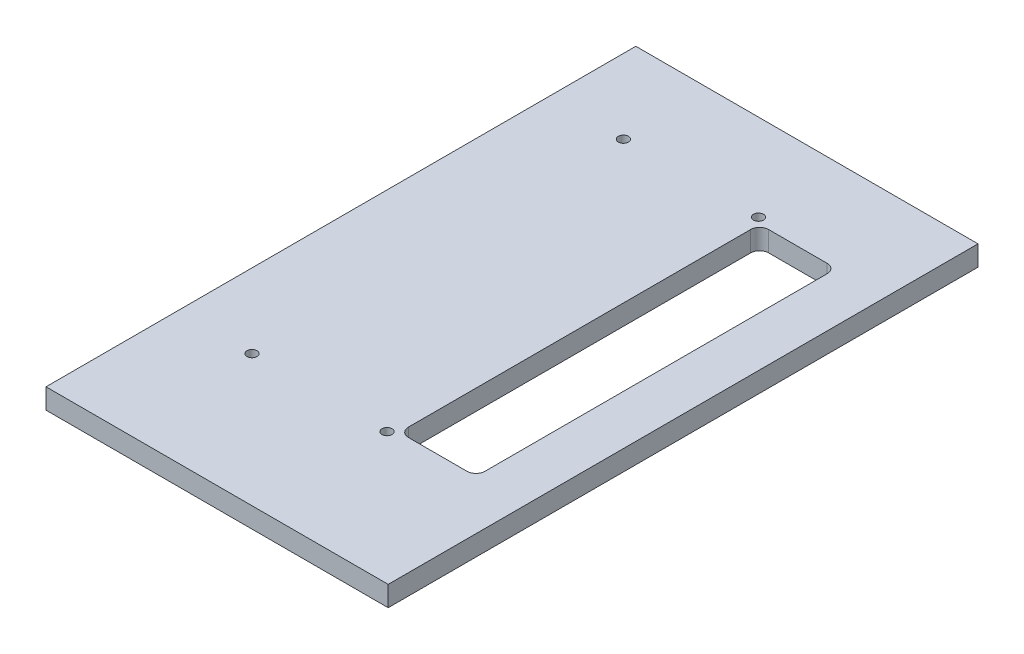
ISO-10303-21;
HEADER;
FILE_DESCRIPTION(('STEP AP214'),'2;1');
FILE_NAME('part.step','',(''),(''),'','','');
FILE_SCHEMA(('AUTOMOTIVE_DESIGN { 1 0 10303 214 1 1 1 1 }'));
ENDSEC;
DATA;
#1=APPLICATION_CONTEXT('core data for automotive mechanical design processes');
#2=APPLICATION_PROTOCOL_DEFINITION('international standard','automotive_design',2000,#1);
#3=PRODUCT_CONTEXT('',#1,'mechanical');
#4=PRODUCT('Part','Part','',(#3));
#5=PRODUCT_RELATED_PRODUCT_CATEGORY('part','',(#4));
#6=PRODUCT_DEFINITION_FORMATION('','',#4);
#7=PRODUCT_DEFINITION_CONTEXT('part definition',#1,'design');
#8=PRODUCT_DEFINITION('design','',#6,#7);
#9=PRODUCT_DEFINITION_SHAPE('','',#8);
#10=(LENGTH_UNIT() NAMED_UNIT(*) SI_UNIT(.MILLI.,.METRE.));
#11=(NAMED_UNIT(*) PLANE_ANGLE_UNIT() SI_UNIT($,.RADIAN.));
#12=(NAMED_UNIT(*) SI_UNIT($,.STERADIAN.) SOLID_ANGLE_UNIT());
#13=UNCERTAINTY_MEASURE_WITH_UNIT(LENGTH_MEASURE(1.E-05),#10,'distance_accuracy_value','');
#14=(GEOMETRIC_REPRESENTATION_CONTEXT(3) GLOBAL_UNCERTAINTY_ASSIGNED_CONTEXT((#13)) GLOBAL_UNIT_ASSIGNED_CONTEXT((#10,
#11,#12)) REPRESENTATION_CONTEXT('',''));
#15=CARTESIAN_POINT('',(0.,0.,0.));
#16=DIRECTION('',(0.,0.,1.));
#17=DIRECTION('',(1.,0.,0.));
#18=AXIS2_PLACEMENT_3D('',#15,#16,#17);
#19=CARTESIAN_POINT('',(0.,9.,0.));
#20=DIRECTION('',(0.,1.,0.));
#21=DIRECTION('',(0.,0.,1.));
#22=AXIS2_PLACEMENT_3D('',#19,#20,#21);
#23=PLANE('',#22);
#24=CARTESIAN_POINT('',(-80.,9.,-82.5));
#25=DIRECTION('',(0.,-1.,0.));
#26=DIRECTION('',(0.,0.,-1.));
#27=AXIS2_PLACEMENT_3D('',#24,#25,#26);
#28=CIRCLE('',#27,2.25);
#29=CARTESIAN_POINT('',(-80.,9.,-84.75));
#30=VERTEX_POINT('',#29);
#31=EDGE_CURVE('E219',#30,#30,#28,.T.);
#32=ORIENTED_EDGE('',*,*,#31,.T.);
#33=EDGE_LOOP('',(#32));
#34=FACE_BOUND('',#33,.T.);
#35=CARTESIAN_POINT('',(-20.,9.,-82.5));
#36=DIRECTION('',(0.,-1.,0.));
#37=DIRECTION('',(0.,0.,-1.));
#38=AXIS2_PLACEMENT_3D('',#35,#36,#37);
#39=CIRCLE('',#38,2.25);
#40=CARTESIAN_POINT('',(-20.,9.,-84.75));
#41=VERTEX_POINT('',#40);
#42=EDGE_CURVE('E243',#41,#41,#39,.T.);
#43=ORIENTED_EDGE('',*,*,#42,.T.);
#44=EDGE_LOOP('',(#43));
#45=FACE_BOUND('',#44,.T.);
#46=CARTESIAN_POINT('',(-80.,9.,82.5));
#47=DIRECTION('',(0.,-1.,0.));
#48=DIRECTION('',(0.,0.,-1.));
#49=AXIS2_PLACEMENT_3D('',#46,#47,#48);
#50=CIRCLE('',#49,2.25);
#51=CARTESIAN_POINT('',(-80.,9.,80.25));
#52=VERTEX_POINT('',#51);
#53=EDGE_CURVE('E246',#52,#52,#50,.T.);
#54=ORIENTED_EDGE('',*,*,#53,.T.);
#55=EDGE_LOOP('',(#54));
#56=FACE_BOUND('',#55,.T.);
#57=CARTESIAN_POINT('',(-20.,9.,82.5));
#58=DIRECTION('',(0.,-1.,0.));
#59=DIRECTION('',(0.,0.,-1.));
#60=AXIS2_PLACEMENT_3D('',#57,#58,#59);
#61=CIRCLE('',#60,2.25);
#62=CARTESIAN_POINT('',(-20.,9.,80.25));
#63=VERTEX_POINT('',#62);
#64=EDGE_CURVE('E161',#63,#63,#61,.T.);
#65=ORIENTED_EDGE('',*,*,#64,.T.);
#66=EDGE_LOOP('',(#65));
#67=FACE_BOUND('',#66,.T.);
#68=DIRECTION('',(0.,0.,1.));
#69=VECTOR('',#68,1.);
#70=CARTESIAN_POINT('',(-113.,9.,-121.));
#71=LINE('',#70,#69);
#72=CARTESIAN_POINT('',(-113.,9.,-121.));
#73=VERTEX_POINT('',#72);
#74=CARTESIAN_POINT('',(-113.,9.,141.));
#75=VERTEX_POINT('',#74);
#76=EDGE_CURVE('E191',#73,#75,#71,.T.);
#77=ORIENTED_EDGE('',*,*,#76,.T.);
#78=DIRECTION('',(1.,0.,0.));
#79=VECTOR('',#78,1.);
#80=CARTESIAN_POINT('',(-113.,9.,141.));
#81=LINE('',#80,#79);
#82=CARTESIAN_POINT('',(39.,9.,141.));
#83=VERTEX_POINT('',#82);
#84=EDGE_CURVE('E194',#75,#83,#81,.T.);
#85=ORIENTED_EDGE('',*,*,#84,.T.);
#86=DIRECTION('',(0.,0.,-1.));
#87=VECTOR('',#86,1.);
#88=CARTESIAN_POINT('',(39.,9.,-121.));
#89=LINE('',#88,#87);
#90=CARTESIAN_POINT('',(39.,9.,-121.));
#91=VERTEX_POINT('',#90);
#92=EDGE_CURVE('E197',#83,#91,#89,.T.);
#93=ORIENTED_EDGE('',*,*,#92,.T.);
#94=DIRECTION('',(-1.,0.,0.));
#95=VECTOR('',#94,1.);
#96=CARTESIAN_POINT('',(-113.,9.,-121.));
#97=LINE('',#96,#95);
#98=EDGE_CURVE('E199',#91,#73,#97,.T.);
#99=ORIENTED_EDGE('',*,*,#98,.T.);
#100=EDGE_LOOP('',(#77,#85,#93,#99));
#101=FACE_BOUND('',#100,.T.);
#102=DIRECTION('',(0.,0.,1.));
#103=VECTOR('',#102,1.);
#104=CARTESIAN_POINT('',(-17.,9.,-76.));
#105=LINE('',#104,#103);
#106=CARTESIAN_POINT('',(-17.,9.,-76.));
#107=VERTEX_POINT('',#106);
#108=CARTESIAN_POINT('',(-17.,9.,76.));
#109=VERTEX_POINT('',#108);
#110=EDGE_CURVE('E132',#107,#109,#105,.T.);
#111=ORIENTED_EDGE('',*,*,#110,.F.);
#112=CARTESIAN_POINT('',(-13.,9.,-76.));
#113=DIRECTION('',(0.,1.,0.));
#114=DIRECTION('',(0.,0.,1.));
#115=AXIS2_PLACEMENT_3D('',#112,#113,#114);
#116=CIRCLE('',#115,4.);
#117=CARTESIAN_POINT('',(-13.,9.,-80.));
#118=VERTEX_POINT('',#117);
#119=EDGE_CURVE('E124',#118,#107,#116,.T.);
#120=ORIENTED_EDGE('',*,*,#119,.F.);
#121=DIRECTION('',(-1.,0.,0.));
#122=VECTOR('',#121,1.);
#123=CARTESIAN_POINT('',(13.,9.,-80.));
#124=LINE('',#123,#122);
#125=CARTESIAN_POINT('',(13.,9.,-80.));
#126=VERTEX_POINT('',#125);
#127=EDGE_CURVE('E158',#126,#118,#124,.T.);
#128=ORIENTED_EDGE('',*,*,#127,.F.);
#129=CARTESIAN_POINT('',(13.,9.,-76.));
#130=DIRECTION('',(0.,1.,0.));
#131=DIRECTION('',(0.,0.,-1.));
#132=AXIS2_PLACEMENT_3D('',#129,#130,#131);
#133=CIRCLE('',#132,4.);
#134=CARTESIAN_POINT('',(17.,9.,-76.));
#135=VERTEX_POINT('',#134);
#136=EDGE_CURVE('E156',#135,#126,#133,.T.);
#137=ORIENTED_EDGE('',*,*,#136,.F.);
#138=DIRECTION('',(0.,0.,-1.));
#139=VECTOR('',#138,1.);
#140=CARTESIAN_POINT('',(17.,9.,-76.));
#141=LINE('',#140,#139);
#142=CARTESIAN_POINT('',(17.,9.,76.));
#143=VERTEX_POINT('',#142);
#144=EDGE_CURVE('E154',#143,#135,#141,.T.);
#145=ORIENTED_EDGE('',*,*,#144,.F.);
#146=CARTESIAN_POINT('',(13.,9.,76.));
#147=DIRECTION('',(0.,1.,0.));
#148=DIRECTION('',(0.,0.,-1.));
#149=AXIS2_PLACEMENT_3D('',#146,#147,#148);
#150=CIRCLE('',#149,4.);
#151=CARTESIAN_POINT('',(13.,9.,80.));
#152=VERTEX_POINT('',#151);
#153=EDGE_CURVE('E152',#152,#143,#150,.T.);
#154=ORIENTED_EDGE('',*,*,#153,.F.);
#155=DIRECTION('',(1.,0.,0.));
#156=VECTOR('',#155,1.);
#157=CARTESIAN_POINT('',(13.,9.,80.));
#158=LINE('',#157,#156);
#159=CARTESIAN_POINT('',(-13.,9.,80.));
#160=VERTEX_POINT('',#159);
#161=EDGE_CURVE('E147',#160,#152,#158,.T.);
#162=ORIENTED_EDGE('',*,*,#161,.F.);
#163=CARTESIAN_POINT('',(-13.,9.,76.));
#164=DIRECTION('',(0.,1.,0.));
#165=DIRECTION('',(0.,0.,-1.));
#166=AXIS2_PLACEMENT_3D('',#163,#164,#165);
#167=CIRCLE('',#166,4.);
#168=EDGE_CURVE('E145',#109,#160,#167,.T.);
#169=ORIENTED_EDGE('',*,*,#168,.F.);
#170=EDGE_LOOP('',(#111,#120,#128,#137,#145,#154,#162,#169));
#171=FACE_BOUND('',#170,.T.);
#172=ADVANCED_FACE('F33',(#34,#45,#56,#67,#101,#171),#23,.T.);
#173=CARTESIAN_POINT('',(0.,0.,0.));
#174=DIRECTION('',(0.,1.,0.));
#175=DIRECTION('',(0.,0.,1.));
#176=AXIS2_PLACEMENT_3D('',#173,#174,#175);
#177=PLANE('',#176);
#178=CARTESIAN_POINT('',(-80.,0.,-82.5));
#179=DIRECTION('',(0.,-1.,0.));
#180=DIRECTION('',(0.,0.,-1.));
#181=AXIS2_PLACEMENT_3D('',#178,#179,#180);
#182=CIRCLE('',#181,4.50000000000001);
#183=CARTESIAN_POINT('',(-80.,0.,-87.));
#184=VERTEX_POINT('',#183);
#185=EDGE_CURVE('E236',#184,#184,#182,.T.);
#186=ORIENTED_EDGE('',*,*,#185,.F.);
#187=EDGE_LOOP('',(#186));
#188=FACE_BOUND('',#187,.T.);
#189=CARTESIAN_POINT('',(-20.,0.,-82.5));
#190=DIRECTION('',(0.,-1.,0.));
#191=DIRECTION('',(0.,0.,-1.));
#192=AXIS2_PLACEMENT_3D('',#189,#190,#191);
#193=CIRCLE('',#192,4.5);
#194=CARTESIAN_POINT('',(-20.,0.,-87.));
#195=VERTEX_POINT('',#194);
#196=EDGE_CURVE('E226',#195,#195,#193,.T.);
#197=ORIENTED_EDGE('',*,*,#196,.F.);
#198=EDGE_LOOP('',(#197));
#199=FACE_BOUND('',#198,.T.);
#200=CARTESIAN_POINT('',(-20.,0.,82.5));
#201=DIRECTION('',(0.,-1.,0.));
#202=DIRECTION('',(0.,0.,-1.));
#203=AXIS2_PLACEMENT_3D('',#200,#201,#202);
#204=CIRCLE('',#203,4.5);
#205=CARTESIAN_POINT('',(-20.,0.,78.));
#206=VERTEX_POINT('',#205);
#207=EDGE_CURVE('E223',#206,#206,#204,.T.);
#208=ORIENTED_EDGE('',*,*,#207,.F.);
#209=EDGE_LOOP('',(#208));
#210=FACE_BOUND('',#209,.T.);
#211=CARTESIAN_POINT('',(-80.,0.,82.5));
#212=DIRECTION('',(0.,-1.,0.));
#213=DIRECTION('',(0.,0.,-1.));
#214=AXIS2_PLACEMENT_3D('',#211,#212,#213);
#215=CIRCLE('',#214,4.50000000000001);
#216=CARTESIAN_POINT('',(-80.,0.,78.));
#217=VERTEX_POINT('',#216);
#218=EDGE_CURVE('E220',#217,#217,#215,.T.);
#219=ORIENTED_EDGE('',*,*,#218,.F.);
#220=EDGE_LOOP('',(#219));
#221=FACE_BOUND('',#220,.T.);
#222=DIRECTION('',(0.,0.,1.));
#223=VECTOR('',#222,1.);
#224=CARTESIAN_POINT('',(-113.,0.,-121.));
#225=LINE('',#224,#223);
#226=CARTESIAN_POINT('',(-113.,0.,-121.));
#227=VERTEX_POINT('',#226);
#228=CARTESIAN_POINT('',(-113.,0.,141.));
#229=VERTEX_POINT('',#228);
#230=EDGE_CURVE('E140',#227,#229,#225,.T.);
#231=ORIENTED_EDGE('',*,*,#230,.F.);
#232=DIRECTION('',(-1.,0.,0.));
#233=VECTOR('',#232,1.);
#234=CARTESIAN_POINT('',(-113.,0.,-121.));
#235=LINE('',#234,#233);
#236=CARTESIAN_POINT('',(39.,0.,-121.));
#237=VERTEX_POINT('',#236);
#238=EDGE_CURVE('E195',#237,#227,#235,.T.);
#239=ORIENTED_EDGE('',*,*,#238,.F.);
#240=DIRECTION('',(0.,0.,-1.));
#241=VECTOR('',#240,1.);
#242=CARTESIAN_POINT('',(39.,0.,-121.));
#243=LINE('',#242,#241);
#244=CARTESIAN_POINT('',(39.,0.,141.));
#245=VERTEX_POINT('',#244);
#246=EDGE_CURVE('E206',#245,#237,#243,.T.);
#247=ORIENTED_EDGE('',*,*,#246,.F.);
#248=DIRECTION('',(1.,0.,0.));
#249=VECTOR('',#248,1.);
#250=CARTESIAN_POINT('',(-113.,0.,141.));
#251=LINE('',#250,#249);
#252=EDGE_CURVE('E204',#229,#245,#251,.T.);
#253=ORIENTED_EDGE('',*,*,#252,.F.);
#254=EDGE_LOOP('',(#231,#239,#247,#253));
#255=FACE_BOUND('',#254,.T.);
#256=CARTESIAN_POINT('',(-13.,0.,-76.));
#257=DIRECTION('',(0.,1.,0.));
#258=DIRECTION('',(0.,0.,1.));
#259=AXIS2_PLACEMENT_3D('',#256,#257,#258);
#260=CIRCLE('',#259,4.);
#261=CARTESIAN_POINT('',(-13.,0.,-80.));
#262=VERTEX_POINT('',#261);
#263=CARTESIAN_POINT('',(-17.,0.,-76.));
#264=VERTEX_POINT('',#263);
#265=EDGE_CURVE('E58',#262,#264,#260,.T.);
#266=ORIENTED_EDGE('',*,*,#265,.T.);
#267=DIRECTION('',(0.,0.,1.));
#268=VECTOR('',#267,1.);
#269=CARTESIAN_POINT('',(-17.,0.,-76.));
#270=LINE('',#269,#268);
#271=CARTESIAN_POINT('',(-17.,0.,76.));
#272=VERTEX_POINT('',#271);
#273=EDGE_CURVE('E139',#264,#272,#270,.T.);
#274=ORIENTED_EDGE('',*,*,#273,.T.);
#275=CARTESIAN_POINT('',(-13.,0.,76.));
#276=DIRECTION('',(0.,1.,0.));
#277=DIRECTION('',(0.,0.,-1.));
#278=AXIS2_PLACEMENT_3D('',#275,#276,#277);
#279=CIRCLE('',#278,4.);
#280=CARTESIAN_POINT('',(-13.,0.,80.));
#281=VERTEX_POINT('',#280);
#282=EDGE_CURVE('E163',#272,#281,#279,.T.);
#283=ORIENTED_EDGE('',*,*,#282,.T.);
#284=DIRECTION('',(1.,0.,0.));
#285=VECTOR('',#284,1.);
#286=CARTESIAN_POINT('',(13.,0.,80.));
#287=LINE('',#286,#285);
#288=CARTESIAN_POINT('',(13.,0.,80.));
#289=VERTEX_POINT('',#288);
#290=EDGE_CURVE('E166',#281,#289,#287,.T.);
#291=ORIENTED_EDGE('',*,*,#290,.T.);
#292=CARTESIAN_POINT('',(13.,0.,76.));
#293=DIRECTION('',(0.,1.,0.));
#294=DIRECTION('',(0.,0.,-1.));
#295=AXIS2_PLACEMENT_3D('',#292,#293,#294);
#296=CIRCLE('',#295,4.);
#297=CARTESIAN_POINT('',(17.,0.,76.));
#298=VERTEX_POINT('',#297);
#299=EDGE_CURVE('E169',#289,#298,#296,.T.);
#300=ORIENTED_EDGE('',*,*,#299,.T.);
#301=DIRECTION('',(0.,0.,-1.));
#302=VECTOR('',#301,1.);
#303=CARTESIAN_POINT('',(17.,0.,-76.));
#304=LINE('',#303,#302);
#305=CARTESIAN_POINT('',(17.,0.,-76.));
#306=VERTEX_POINT('',#305);
#307=EDGE_CURVE('E172',#298,#306,#304,.T.);
#308=ORIENTED_EDGE('',*,*,#307,.T.);
#309=CARTESIAN_POINT('',(13.,0.,-76.));
#310=DIRECTION('',(0.,1.,0.));
#311=DIRECTION('',(0.,0.,-1.));
#312=AXIS2_PLACEMENT_3D('',#309,#310,#311);
#313=CIRCLE('',#312,4.);
#314=CARTESIAN_POINT('',(13.,0.,-80.));
#315=VERTEX_POINT('',#314);
#316=EDGE_CURVE('E175',#306,#315,#313,.T.);
#317=ORIENTED_EDGE('',*,*,#316,.T.);
#318=DIRECTION('',(-1.,0.,0.));
#319=VECTOR('',#318,1.);
#320=CARTESIAN_POINT('',(13.,0.,-80.));
#321=LINE('',#320,#319);
#322=EDGE_CURVE('E133',#315,#262,#321,.T.);
#323=ORIENTED_EDGE('',*,*,#322,.T.);
#324=EDGE_LOOP('',(#266,#274,#283,#291,#300,#308,#317,#323));
#325=FACE_BOUND('',#324,.T.);
#326=ADVANCED_FACE('F269',(#188,#199,#210,#221,#255,#325),#177,.F.);
#327=CARTESIAN_POINT('',(-113.,9.,-121.));
#328=DIRECTION('',(1.,0.,0.));
#329=DIRECTION('',(0.,0.,-1.));
#330=AXIS2_PLACEMENT_3D('',#327,#328,#329);
#331=PLANE('',#330);
#332=ORIENTED_EDGE('',*,*,#230,.T.);
#333=DIRECTION('',(0.,-1.,0.));
#334=VECTOR('',#333,1.);
#335=CARTESIAN_POINT('',(-113.,9.,141.));
#336=LINE('',#335,#334);
#337=EDGE_CURVE('E11',#75,#229,#336,.T.);
#338=ORIENTED_EDGE('',*,*,#337,.F.);
#339=ORIENTED_EDGE('',*,*,#76,.F.);
#340=DIRECTION('',(0.,-1.,0.));
#341=VECTOR('',#340,1.);
#342=CARTESIAN_POINT('',(-113.,9.,-121.));
#343=LINE('',#342,#341);
#344=EDGE_CURVE('E201',#73,#227,#343,.T.);
#345=ORIENTED_EDGE('',*,*,#344,.T.);
#346=EDGE_LOOP('',(#332,#338,#339,#345));
#347=FACE_BOUND('',#346,.T.);
#348=ADVANCED_FACE('F35',(#347),#331,.F.);
#349=CARTESIAN_POINT('',(-113.,9.,141.));
#350=DIRECTION('',(0.,0.,-1.));
#351=DIRECTION('',(-1.,0.,0.));
#352=AXIS2_PLACEMENT_3D('',#349,#350,#351);
#353=PLANE('',#352);
#354=ORIENTED_EDGE('',*,*,#252,.T.);
#355=DIRECTION('',(0.,-1.,0.));
#356=VECTOR('',#355,1.);
#357=CARTESIAN_POINT('',(39.,9.,141.));
#358=LINE('',#357,#356);
#359=EDGE_CURVE('E42',#83,#245,#358,.T.);
#360=ORIENTED_EDGE('',*,*,#359,.F.);
#361=ORIENTED_EDGE('',*,*,#84,.F.);
#362=ORIENTED_EDGE('',*,*,#337,.T.);
#363=EDGE_LOOP('',(#354,#360,#361,#362));
#364=FACE_BOUND('',#363,.T.);
#365=ADVANCED_FACE('F287',(#364),#353,.F.);
#366=CARTESIAN_POINT('',(39.,9.,-121.));
#367=DIRECTION('',(-1.,0.,0.));
#368=DIRECTION('',(0.,0.,1.));
#369=AXIS2_PLACEMENT_3D('',#366,#367,#368);
#370=PLANE('',#369);
#371=ORIENTED_EDGE('',*,*,#246,.T.);
#372=DIRECTION('',(0.,-1.,0.));
#373=VECTOR('',#372,1.);
#374=CARTESIAN_POINT('',(39.,9.,-121.));
#375=LINE('',#374,#373);
#376=EDGE_CURVE('E211',#91,#237,#375,.T.);
#377=ORIENTED_EDGE('',*,*,#376,.F.);
#378=ORIENTED_EDGE('',*,*,#92,.F.);
#379=ORIENTED_EDGE('',*,*,#359,.T.);
#380=EDGE_LOOP('',(#371,#377,#378,#379));
#381=FACE_BOUND('',#380,.T.);
#382=ADVANCED_FACE('F284',(#381),#370,.F.);
#383=CARTESIAN_POINT('',(-113.,9.,-121.));
#384=DIRECTION('',(0.,0.,1.));
#385=DIRECTION('',(1.,0.,0.));
#386=AXIS2_PLACEMENT_3D('',#383,#384,#385);
#387=PLANE('',#386);
#388=ORIENTED_EDGE('',*,*,#238,.T.);
#389=ORIENTED_EDGE('',*,*,#344,.F.);
#390=ORIENTED_EDGE('',*,*,#98,.F.);
#391=ORIENTED_EDGE('',*,*,#376,.T.);
#392=EDGE_LOOP('',(#388,#389,#390,#391));
#393=FACE_BOUND('',#392,.T.);
#394=ADVANCED_FACE('F281',(#393),#387,.F.);
#395=CARTESIAN_POINT('',(-13.,9.,-76.));
#396=DIRECTION('',(0.,-1.,0.));
#397=DIRECTION('',(0.,0.,-1.));
#398=AXIS2_PLACEMENT_3D('',#395,#396,#397);
#399=CYLINDRICAL_SURFACE('',#398,4.);
#400=ORIENTED_EDGE('',*,*,#265,.F.);
#401=DIRECTION('',(0.,-1.,0.));
#402=VECTOR('',#401,1.);
#403=CARTESIAN_POINT('',(-13.,9.,-80.));
#404=LINE('',#403,#402);
#405=EDGE_CURVE('E128',#118,#262,#404,.T.);
#406=ORIENTED_EDGE('',*,*,#405,.F.);
#407=ORIENTED_EDGE('',*,*,#119,.T.);
#408=DIRECTION('',(0.,-1.,0.));
#409=VECTOR('',#408,1.);
#410=CARTESIAN_POINT('',(-17.,9.,-76.));
#411=LINE('',#410,#409);
#412=EDGE_CURVE('E127',#107,#264,#411,.T.);
#413=ORIENTED_EDGE('',*,*,#412,.T.);
#414=EDGE_LOOP('',(#400,#406,#407,#413));
#415=FACE_BOUND('',#414,.T.);
#416=ADVANCED_FACE('F126',(#415),#399,.F.);
#417=CARTESIAN_POINT('',(-17.,9.,-76.));
#418=DIRECTION('',(1.,0.,0.));
#419=DIRECTION('',(0.,0.,-1.));
#420=AXIS2_PLACEMENT_3D('',#417,#418,#419);
#421=PLANE('',#420);
#422=ORIENTED_EDGE('',*,*,#273,.F.);
#423=ORIENTED_EDGE('',*,*,#412,.F.);
#424=ORIENTED_EDGE('',*,*,#110,.T.);
#425=DIRECTION('',(0.,-1.,0.));
#426=VECTOR('',#425,1.);
#427=CARTESIAN_POINT('',(-17.,9.,76.));
#428=LINE('',#427,#426);
#429=EDGE_CURVE('E141',#109,#272,#428,.T.);
#430=ORIENTED_EDGE('',*,*,#429,.T.);
#431=EDGE_LOOP('',(#422,#423,#424,#430));
#432=FACE_BOUND('',#431,.T.);
#433=ADVANCED_FACE('F136',(#432),#421,.T.);
#434=CARTESIAN_POINT('',(-13.,9.,76.));
#435=DIRECTION('',(0.,-1.,0.));
#436=DIRECTION('',(0.,0.,-1.));
#437=AXIS2_PLACEMENT_3D('',#434,#435,#436);
#438=CYLINDRICAL_SURFACE('',#437,4.);
#439=ORIENTED_EDGE('',*,*,#282,.F.);
#440=ORIENTED_EDGE('',*,*,#429,.F.);
#441=ORIENTED_EDGE('',*,*,#168,.T.);
#442=DIRECTION('',(0.,-1.,0.));
#443=VECTOR('',#442,1.);
#444=CARTESIAN_POINT('',(-13.,9.,80.));
#445=LINE('',#444,#443);
#446=EDGE_CURVE('E188',#160,#281,#445,.T.);
#447=ORIENTED_EDGE('',*,*,#446,.T.);
#448=EDGE_LOOP('',(#439,#440,#441,#447));
#449=FACE_BOUND('',#448,.T.);
#450=ADVANCED_FACE('F327',(#449),#438,.F.);
#451=CARTESIAN_POINT('',(13.,9.,80.));
#452=DIRECTION('',(0.,0.,-1.));
#453=DIRECTION('',(-1.,0.,0.));
#454=AXIS2_PLACEMENT_3D('',#451,#452,#453);
#455=PLANE('',#454);
#456=ORIENTED_EDGE('',*,*,#290,.F.);
#457=ORIENTED_EDGE('',*,*,#446,.F.);
#458=ORIENTED_EDGE('',*,*,#161,.T.);
#459=DIRECTION('',(0.,-1.,0.));
#460=VECTOR('',#459,1.);
#461=CARTESIAN_POINT('',(13.,9.,80.));
#462=LINE('',#461,#460);
#463=EDGE_CURVE('E186',#152,#289,#462,.T.);
#464=ORIENTED_EDGE('',*,*,#463,.T.);
#465=EDGE_LOOP('',(#456,#457,#458,#464));
#466=FACE_BOUND('',#465,.T.);
#467=ADVANCED_FACE('F324',(#466),#455,.T.);
#468=CARTESIAN_POINT('',(13.,9.,76.));
#469=DIRECTION('',(0.,-1.,0.));
#470=DIRECTION('',(0.,0.,-1.));
#471=AXIS2_PLACEMENT_3D('',#468,#469,#470);
#472=CYLINDRICAL_SURFACE('',#471,4.);
#473=ORIENTED_EDGE('',*,*,#299,.F.);
#474=ORIENTED_EDGE('',*,*,#463,.F.);
#475=ORIENTED_EDGE('',*,*,#153,.T.);
#476=DIRECTION('',(0.,-1.,0.));
#477=VECTOR('',#476,1.);
#478=CARTESIAN_POINT('',(17.,9.,76.));
#479=LINE('',#478,#477);
#480=EDGE_CURVE('E184',#143,#298,#479,.T.);
#481=ORIENTED_EDGE('',*,*,#480,.T.);
#482=EDGE_LOOP('',(#473,#474,#475,#481));
#483=FACE_BOUND('',#482,.T.);
#484=ADVANCED_FACE('F319',(#483),#472,.F.);
#485=CARTESIAN_POINT('',(17.,9.,-76.));
#486=DIRECTION('',(-1.,0.,0.));
#487=DIRECTION('',(0.,0.,1.));
#488=AXIS2_PLACEMENT_3D('',#485,#486,#487);
#489=PLANE('',#488);
#490=ORIENTED_EDGE('',*,*,#307,.F.);
#491=ORIENTED_EDGE('',*,*,#480,.F.);
#492=ORIENTED_EDGE('',*,*,#144,.T.);
#493=DIRECTION('',(0.,-1.,0.));
#494=VECTOR('',#493,1.);
#495=CARTESIAN_POINT('',(17.,9.,-76.));
#496=LINE('',#495,#494);
#497=EDGE_CURVE('E182',#135,#306,#496,.T.);
#498=ORIENTED_EDGE('',*,*,#497,.T.);
#499=EDGE_LOOP('',(#490,#491,#492,#498));
#500=FACE_BOUND('',#499,.T.);
#501=ADVANCED_FACE('F315',(#500),#489,.T.);
#502=CARTESIAN_POINT('',(13.,9.,-76.));
#503=DIRECTION('',(0.,-1.,0.));
#504=DIRECTION('',(0.,0.,-1.));
#505=AXIS2_PLACEMENT_3D('',#502,#503,#504);
#506=CYLINDRICAL_SURFACE('',#505,4.);
#507=ORIENTED_EDGE('',*,*,#316,.F.);
#508=ORIENTED_EDGE('',*,*,#497,.F.);
#509=ORIENTED_EDGE('',*,*,#136,.T.);
#510=DIRECTION('',(0.,-1.,0.));
#511=VECTOR('',#510,1.);
#512=CARTESIAN_POINT('',(13.,9.,-80.));
#513=LINE('',#512,#511);
#514=EDGE_CURVE('E50',#126,#315,#513,.T.);
#515=ORIENTED_EDGE('',*,*,#514,.T.);
#516=EDGE_LOOP('',(#507,#508,#509,#515));
#517=FACE_BOUND('',#516,.T.);
#518=ADVANCED_FACE('F266',(#517),#506,.F.);
#519=CARTESIAN_POINT('',(13.,9.,-80.));
#520=DIRECTION('',(0.,0.,1.));
#521=DIRECTION('',(1.,0.,0.));
#522=AXIS2_PLACEMENT_3D('',#519,#520,#521);
#523=PLANE('',#522);
#524=ORIENTED_EDGE('',*,*,#322,.F.);
#525=ORIENTED_EDGE('',*,*,#514,.F.);
#526=ORIENTED_EDGE('',*,*,#127,.T.);
#527=ORIENTED_EDGE('',*,*,#405,.T.);
#528=EDGE_LOOP('',(#524,#525,#526,#527));
#529=FACE_BOUND('',#528,.T.);
#530=ADVANCED_FACE('F256',(#529),#523,.T.);
#531=CARTESIAN_POINT('',(-20.,9.,82.5));
#532=DIRECTION('',(0.,-1.,0.));
#533=DIRECTION('',(0.,0.,-1.));
#534=AXIS2_PLACEMENT_3D('',#531,#532,#533);
#535=CYLINDRICAL_SURFACE('',#534,2.25);
#536=CARTESIAN_POINT('',(-20.,2.24999999999999,82.5));
#537=DIRECTION('',(0.,-1.,0.));
#538=DIRECTION('',(0.,0.,-1.));
#539=AXIS2_PLACEMENT_3D('',#536,#537,#538);
#540=CIRCLE('',#539,2.25);
#541=CARTESIAN_POINT('',(-20.,2.24999999999999,80.25));
#542=VERTEX_POINT('',#541);
#543=EDGE_CURVE('E221',#542,#542,#540,.T.);
#544=ORIENTED_EDGE('',*,*,#543,.T.);
#545=EDGE_LOOP('',(#544));
#546=FACE_BOUND('',#545,.T.);
#547=ORIENTED_EDGE('',*,*,#64,.F.);
#548=EDGE_LOOP('',(#547));
#549=FACE_BOUND('',#548,.T.);
#550=ADVANCED_FACE('F253',(#546,#549),#535,.F.);
#551=CARTESIAN_POINT('',(-80.,9.,82.5));
#552=DIRECTION('',(0.,-1.,0.));
#553=DIRECTION('',(0.,0.,-1.));
#554=AXIS2_PLACEMENT_3D('',#551,#552,#553);
#555=CYLINDRICAL_SURFACE('',#554,2.25);
#556=CARTESIAN_POINT('',(-80.,2.25,82.5));
#557=DIRECTION('',(0.,-1.,0.));
#558=DIRECTION('',(0.,0.,-1.));
#559=AXIS2_PLACEMENT_3D('',#556,#557,#558);
#560=CIRCLE('',#559,2.25);
#561=CARTESIAN_POINT('',(-80.,2.25,80.25));
#562=VERTEX_POINT('',#561);
#563=EDGE_CURVE('E216',#562,#562,#560,.T.);
#564=ORIENTED_EDGE('',*,*,#563,.T.);
#565=EDGE_LOOP('',(#564));
#566=FACE_BOUND('',#565,.T.);
#567=ORIENTED_EDGE('',*,*,#53,.F.);
#568=EDGE_LOOP('',(#567));
#569=FACE_BOUND('',#568,.T.);
#570=ADVANCED_FACE('F255',(#566,#569),#555,.F.);
#571=CARTESIAN_POINT('',(-20.,9.,-82.5));
#572=DIRECTION('',(0.,-1.,0.));
#573=DIRECTION('',(0.,0.,-1.));
#574=AXIS2_PLACEMENT_3D('',#571,#572,#573);
#575=CYLINDRICAL_SURFACE('',#574,2.25);
#576=CARTESIAN_POINT('',(-20.,2.24999999999999,-82.5));
#577=DIRECTION('',(0.,-1.,0.));
#578=DIRECTION('',(0.,0.,-1.));
#579=AXIS2_PLACEMENT_3D('',#576,#577,#578);
#580=CIRCLE('',#579,2.25);
#581=CARTESIAN_POINT('',(-20.,2.24999999999999,-84.75));
#582=VERTEX_POINT('',#581);
#583=EDGE_CURVE('E224',#582,#582,#580,.T.);
#584=ORIENTED_EDGE('',*,*,#583,.T.);
#585=EDGE_LOOP('',(#584));
#586=FACE_BOUND('',#585,.T.);
#587=ORIENTED_EDGE('',*,*,#42,.F.);
#588=EDGE_LOOP('',(#587));
#589=FACE_BOUND('',#588,.T.);
#590=ADVANCED_FACE('F263',(#586,#589),#575,.F.);
#591=CARTESIAN_POINT('',(-80.,9.,-82.5));
#592=DIRECTION('',(0.,-1.,0.));
#593=DIRECTION('',(0.,0.,-1.));
#594=AXIS2_PLACEMENT_3D('',#591,#592,#593);
#595=CYLINDRICAL_SURFACE('',#594,2.25);
#596=CARTESIAN_POINT('',(-80.,2.25,-82.5));
#597=DIRECTION('',(0.,-1.,0.));
#598=DIRECTION('',(0.,0.,-1.));
#599=AXIS2_PLACEMENT_3D('',#596,#597,#598);
#600=CIRCLE('',#599,2.25);
#601=CARTESIAN_POINT('',(-80.,2.25,-84.75));
#602=VERTEX_POINT('',#601);
#603=EDGE_CURVE('E37',#602,#602,#600,.T.);
#604=ORIENTED_EDGE('',*,*,#603,.T.);
#605=EDGE_LOOP('',(#604));
#606=FACE_BOUND('',#605,.T.);
#607=ORIENTED_EDGE('',*,*,#31,.F.);
#608=EDGE_LOOP('',(#607));
#609=FACE_BOUND('',#608,.T.);
#610=ADVANCED_FACE('F379',(#606,#609),#595,.F.);
#611=CARTESIAN_POINT('',(-80.,0.,82.5));
#612=DIRECTION('',(0.,-1.,0.));
#613=DIRECTION('',(0.,0.,-1.));
#614=AXIS2_PLACEMENT_3D('',#611,#612,#613);
#615=CONICAL_SURFACE('',#614,4.50000000000001,0.78539816339745);
#616=ORIENTED_EDGE('',*,*,#218,.T.);
#617=EDGE_LOOP('',(#616));
#618=FACE_BOUND('',#617,.T.);
#619=ORIENTED_EDGE('',*,*,#563,.F.);
#620=EDGE_LOOP('',(#619));
#621=FACE_BOUND('',#620,.T.);
#622=ADVANCED_FACE('F388',(#618,#621),#615,.F.);
#623=CARTESIAN_POINT('',(-20.,0.,82.5));
#624=DIRECTION('',(0.,-1.,0.));
#625=DIRECTION('',(0.,0.,-1.));
#626=AXIS2_PLACEMENT_3D('',#623,#624,#625);
#627=CONICAL_SURFACE('',#626,4.5,0.78539816339745);
#628=ORIENTED_EDGE('',*,*,#207,.T.);
#629=EDGE_LOOP('',(#628));
#630=FACE_BOUND('',#629,.T.);
#631=ORIENTED_EDGE('',*,*,#543,.F.);
#632=EDGE_LOOP('',(#631));
#633=FACE_BOUND('',#632,.T.);
#634=ADVANCED_FACE('F398',(#630,#633),#627,.F.);
#635=CARTESIAN_POINT('',(-20.,0.,-82.5));
#636=DIRECTION('',(0.,-1.,0.));
#637=DIRECTION('',(0.,0.,-1.));
#638=AXIS2_PLACEMENT_3D('',#635,#636,#637);
#639=CONICAL_SURFACE('',#638,4.5,0.78539816339745);
#640=ORIENTED_EDGE('',*,*,#196,.T.);
#641=EDGE_LOOP('',(#640));
#642=FACE_BOUND('',#641,.T.);
#643=ORIENTED_EDGE('',*,*,#583,.F.);
#644=EDGE_LOOP('',(#643));
#645=FACE_BOUND('',#644,.T.);
#646=ADVANCED_FACE('F408',(#642,#645),#639,.F.);
#647=CARTESIAN_POINT('',(-80.,0.,-82.5));
#648=DIRECTION('',(0.,-1.,0.));
#649=DIRECTION('',(0.,0.,-1.));
#650=AXIS2_PLACEMENT_3D('',#647,#648,#649);
#651=CONICAL_SURFACE('',#650,4.50000000000001,0.78539816339745);
#652=ORIENTED_EDGE('',*,*,#185,.T.);
#653=EDGE_LOOP('',(#652));
#654=FACE_BOUND('',#653,.T.);
#655=ORIENTED_EDGE('',*,*,#603,.F.);
#656=EDGE_LOOP('',(#655));
#657=FACE_BOUND('',#656,.T.);
#658=ADVANCED_FACE('F418',(#654,#657),#651,.F.);
#659=CLOSED_SHELL('',(#172,#326,#348,#365,#382,#394,#416,#433,#450,#467,#484,#501,#518,#530,
#550,#570,#590,#610,#622,#634,#646,#658));
#660=MANIFOLD_SOLID_BREP('B2',#659);
#661=ADVANCED_BREP_SHAPE_REPRESENTATION('',(#18,#660),#14);
#662=SHAPE_DEFINITION_REPRESENTATION(#9,#661);
ENDSEC;
END-ISO-10303-21;
